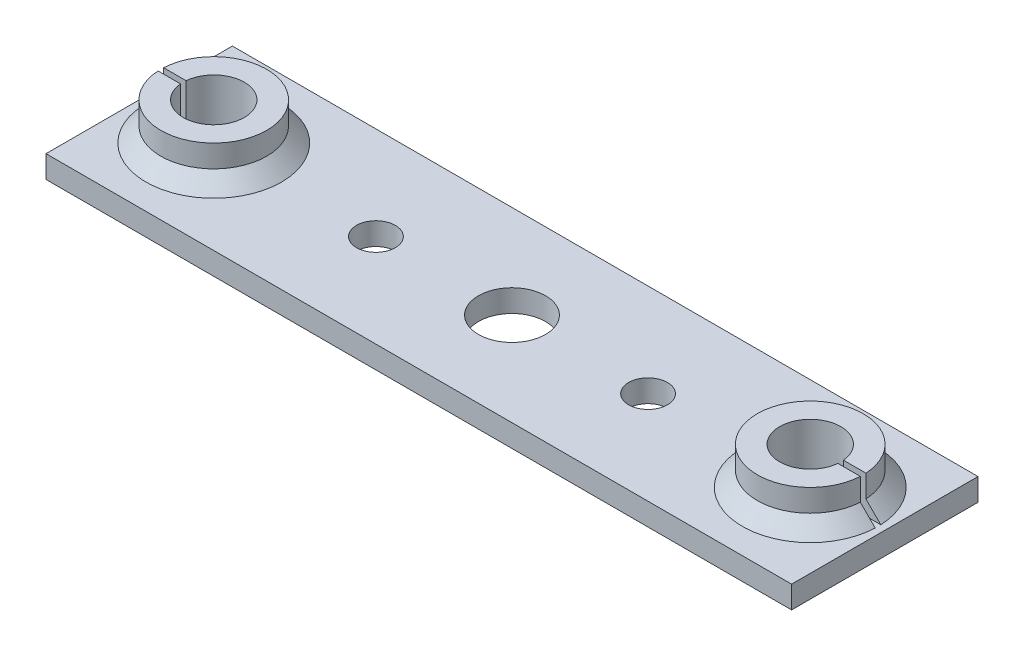
ISO-10303-21;
HEADER;
FILE_DESCRIPTION(('STEP AP214'),'2;1');
FILE_NAME('part.step','',(''),(''),'','','');
FILE_SCHEMA(('AUTOMOTIVE_DESIGN { 1 0 10303 214 1 1 1 1 }'));
ENDSEC;
DATA;
#1=APPLICATION_CONTEXT('core data for automotive mechanical design processes');
#2=APPLICATION_PROTOCOL_DEFINITION('international standard','automotive_design',2000,#1);
#3=PRODUCT_CONTEXT('',#1,'mechanical');
#4=PRODUCT('Part','Part','',(#3));
#5=PRODUCT_RELATED_PRODUCT_CATEGORY('part','',(#4));
#6=PRODUCT_DEFINITION_FORMATION('','',#4);
#7=PRODUCT_DEFINITION_CONTEXT('part definition',#1,'design');
#8=PRODUCT_DEFINITION('design','',#6,#7);
#9=PRODUCT_DEFINITION_SHAPE('','',#8);
#10=(LENGTH_UNIT() NAMED_UNIT(*) SI_UNIT(.MILLI.,.METRE.));
#11=(NAMED_UNIT(*) PLANE_ANGLE_UNIT() SI_UNIT($,.RADIAN.));
#12=(NAMED_UNIT(*) SI_UNIT($,.STERADIAN.) SOLID_ANGLE_UNIT());
#13=UNCERTAINTY_MEASURE_WITH_UNIT(LENGTH_MEASURE(1.E-05),#10,'distance_accuracy_value','');
#14=(GEOMETRIC_REPRESENTATION_CONTEXT(3) GLOBAL_UNCERTAINTY_ASSIGNED_CONTEXT((#13)) GLOBAL_UNIT_ASSIGNED_CONTEXT((#10,
#11,#12)) REPRESENTATION_CONTEXT('',''));
#15=CARTESIAN_POINT('',(0.,0.,0.));
#16=DIRECTION('',(0.,0.,1.));
#17=DIRECTION('',(1.,0.,0.));
#18=AXIS2_PLACEMENT_3D('',#15,#16,#17);
#19=CARTESIAN_POINT('',(0.,3.,0.));
#20=DIRECTION('',(0.,1.,0.));
#21=DIRECTION('',(0.,0.,1.));
#22=AXIS2_PLACEMENT_3D('',#19,#20,#21);
#23=PLANE('',#22);
#24=CARTESIAN_POINT('',(40.,3.,0.));
#25=DIRECTION('',(0.,1.,0.));
#26=DIRECTION('',(0.,0.,1.));
#27=AXIS2_PLACEMENT_3D('',#24,#25,#26);
#28=CIRCLE('',#27,9.10000000000004);
#29=CARTESIAN_POINT('',(49.0922700685803,3.,0.37499999999999));
#30=VERTEX_POINT('',#29);
#31=CARTESIAN_POINT('',(49.0922700685803,3.,-0.375000000000011));
#32=VERTEX_POINT('',#31);
#33=EDGE_CURVE('E267',#30,#32,#28,.F.);
#34=ORIENTED_EDGE('',*,*,#33,.T.);
#35=DIRECTION('',(1.,0.,0.));
#36=VECTOR('',#35,1.);
#37=CARTESIAN_POINT('',(0.,3.,-0.375000000000004));
#38=LINE('',#37,#36);
#39=CARTESIAN_POINT('',(44.0828145929003,3.,-0.37500000000001));
#40=VERTEX_POINT('',#39);
#41=EDGE_CURVE('E162',#40,#32,#38,.T.);
#42=ORIENTED_EDGE('',*,*,#41,.F.);
#43=CARTESIAN_POINT('',(40.,3.,0.));
#44=DIRECTION('',(0.,1.,0.));
#45=DIRECTION('',(0.,0.,-1.));
#46=AXIS2_PLACEMENT_3D('',#43,#44,#45);
#47=CIRCLE('',#46,4.1);
#48=CARTESIAN_POINT('',(44.0828145929003,3.,0.37499999999999));
#49=VERTEX_POINT('',#48);
#50=EDGE_CURVE('E223',#49,#40,#47,.T.);
#51=ORIENTED_EDGE('',*,*,#50,.F.);
#52=DIRECTION('',(1.,0.,0.));
#53=VECTOR('',#52,1.);
#54=CARTESIAN_POINT('',(0.,3.,0.374999999999995));
#55=LINE('',#54,#53);
#56=EDGE_CURVE('E173',#49,#30,#55,.T.);
#57=ORIENTED_EDGE('',*,*,#56,.T.);
#58=EDGE_LOOP('',(#34,#42,#51,#57));
#59=FACE_BOUND('',#58,.T.);
#60=DIRECTION('',(-1.,0.,0.));
#61=VECTOR('',#60,1.);
#62=CARTESIAN_POINT('',(0.,3.,-0.375000000000004));
#63=LINE('',#62,#61);
#64=CARTESIAN_POINT('',(-44.0828145929003,3.,-0.374999999999999));
#65=VERTEX_POINT('',#64);
#66=CARTESIAN_POINT('',(-49.0922700685802,3.,-0.374999999999999));
#67=VERTEX_POINT('',#66);
#68=EDGE_CURVE('E184',#65,#67,#63,.T.);
#69=ORIENTED_EDGE('',*,*,#68,.T.);
#70=CARTESIAN_POINT('',(-40.,3.,0.));
#71=DIRECTION('',(0.,1.,0.));
#72=DIRECTION('',(0.,0.,1.));
#73=AXIS2_PLACEMENT_3D('',#70,#71,#72);
#74=CIRCLE('',#73,9.10000000000001);
#75=CARTESIAN_POINT('',(-49.0922700685802,3.,0.375000000000002));
#76=VERTEX_POINT('',#75);
#77=EDGE_CURVE('E264',#67,#76,#74,.F.);
#78=ORIENTED_EDGE('',*,*,#77,.T.);
#79=DIRECTION('',(-1.,0.,0.));
#80=VECTOR('',#79,1.);
#81=CARTESIAN_POINT('',(0.,3.,0.374999999999995));
#82=LINE('',#81,#80);
#83=CARTESIAN_POINT('',(-44.0828145929003,3.,0.375000000000001));
#84=VERTEX_POINT('',#83);
#85=EDGE_CURVE('E152',#84,#76,#82,.T.);
#86=ORIENTED_EDGE('',*,*,#85,.F.);
#87=CARTESIAN_POINT('',(-40.,3.,0.));
#88=DIRECTION('',(0.,1.,0.));
#89=DIRECTION('',(0.,0.,1.));
#90=AXIS2_PLACEMENT_3D('',#87,#88,#89);
#91=CIRCLE('',#90,4.1);
#92=EDGE_CURVE('E229',#65,#84,#91,.T.);
#93=ORIENTED_EDGE('',*,*,#92,.F.);
#94=EDGE_LOOP('',(#69,#78,#86,#93));
#95=FACE_BOUND('',#94,.T.);
#96=CARTESIAN_POINT('',(18.25,3.,0.));
#97=DIRECTION('',(0.,1.,0.));
#98=DIRECTION('',(0.,0.,-1.));
#99=AXIS2_PLACEMENT_3D('',#96,#97,#98);
#100=CIRCLE('',#99,2.6);
#101=CARTESIAN_POINT('',(18.25,3.,-2.6));
#102=VERTEX_POINT('',#101);
#103=EDGE_CURVE('E211',#102,#102,#100,.T.);
#104=ORIENTED_EDGE('',*,*,#103,.F.);
#105=EDGE_LOOP('',(#104));
#106=FACE_BOUND('',#105,.T.);
#107=DIRECTION('',(0.,0.,1.));
#108=VECTOR('',#107,1.);
#109=CARTESIAN_POINT('',(-50.,3.,12.5));
#110=LINE('',#109,#108);
#111=CARTESIAN_POINT('',(-50.,3.,-12.5));
#112=VERTEX_POINT('',#111);
#113=CARTESIAN_POINT('',(-50.,3.,12.5));
#114=VERTEX_POINT('',#113);
#115=EDGE_CURVE('E235',#112,#114,#110,.T.);
#116=ORIENTED_EDGE('',*,*,#115,.T.);
#117=DIRECTION('',(1.,0.,0.));
#118=VECTOR('',#117,1.);
#119=CARTESIAN_POINT('',(50.,3.,12.5));
#120=LINE('',#119,#118);
#121=CARTESIAN_POINT('',(50.,3.,12.5));
#122=VERTEX_POINT('',#121);
#123=EDGE_CURVE('E238',#114,#122,#120,.T.);
#124=ORIENTED_EDGE('',*,*,#123,.T.);
#125=DIRECTION('',(0.,0.,-1.));
#126=VECTOR('',#125,1.);
#127=CARTESIAN_POINT('',(50.,3.,12.5));
#128=LINE('',#127,#126);
#129=CARTESIAN_POINT('',(50.,3.,-12.5));
#130=VERTEX_POINT('',#129);
#131=EDGE_CURVE('E241',#122,#130,#128,.T.);
#132=ORIENTED_EDGE('',*,*,#131,.T.);
#133=DIRECTION('',(-1.,0.,0.));
#134=VECTOR('',#133,1.);
#135=CARTESIAN_POINT('',(50.,3.,-12.5));
#136=LINE('',#135,#134);
#137=EDGE_CURVE('E243',#130,#112,#136,.T.);
#138=ORIENTED_EDGE('',*,*,#137,.T.);
#139=EDGE_LOOP('',(#116,#124,#132,#138));
#140=FACE_BOUND('',#139,.T.);
#141=CARTESIAN_POINT('',(-18.25,3.,0.));
#142=DIRECTION('',(0.,1.,0.));
#143=DIRECTION('',(0.,0.,1.));
#144=AXIS2_PLACEMENT_3D('',#141,#142,#143);
#145=CIRCLE('',#144,2.6);
#146=CARTESIAN_POINT('',(-18.25,3.,2.6));
#147=VERTEX_POINT('',#146);
#148=EDGE_CURVE('E217',#147,#147,#145,.T.);
#149=ORIENTED_EDGE('',*,*,#148,.F.);
#150=EDGE_LOOP('',(#149));
#151=FACE_BOUND('',#150,.T.);
#152=CARTESIAN_POINT('',(0.,3.,0.));
#153=DIRECTION('',(0.,1.,0.));
#154=DIRECTION('',(0.,0.,1.));
#155=AXIS2_PLACEMENT_3D('',#152,#153,#154);
#156=CIRCLE('',#155,4.5);
#157=CARTESIAN_POINT('',(0.,3.,4.5));
#158=VERTEX_POINT('',#157);
#159=EDGE_CURVE('E205',#158,#158,#156,.T.);
#160=ORIENTED_EDGE('',*,*,#159,.F.);
#161=EDGE_LOOP('',(#160));
#162=FACE_BOUND('',#161,.T.);
#163=ADVANCED_FACE('F35',(#59,#95,#106,#140,#151,#162),#23,.T.);
#164=CARTESIAN_POINT('',(0.,0.,0.));
#165=DIRECTION('',(0.,1.,0.));
#166=DIRECTION('',(0.,0.,1.));
#167=AXIS2_PLACEMENT_3D('',#164,#165,#166);
#168=PLANE('',#167);
#169=DIRECTION('',(0.,0.,1.));
#170=VECTOR('',#169,1.);
#171=CARTESIAN_POINT('',(-50.,0.,12.5));
#172=LINE('',#171,#170);
#173=CARTESIAN_POINT('',(-50.,0.,-12.5));
#174=VERTEX_POINT('',#173);
#175=CARTESIAN_POINT('',(-50.,0.,12.5));
#176=VERTEX_POINT('',#175);
#177=EDGE_CURVE('E232',#174,#176,#172,.T.);
#178=ORIENTED_EDGE('',*,*,#177,.F.);
#179=DIRECTION('',(-1.,0.,0.));
#180=VECTOR('',#179,1.);
#181=CARTESIAN_POINT('',(50.,0.,-12.5));
#182=LINE('',#181,#180);
#183=CARTESIAN_POINT('',(50.,0.,-12.5));
#184=VERTEX_POINT('',#183);
#185=EDGE_CURVE('E239',#184,#174,#182,.T.);
#186=ORIENTED_EDGE('',*,*,#185,.F.);
#187=DIRECTION('',(0.,0.,-1.));
#188=VECTOR('',#187,1.);
#189=CARTESIAN_POINT('',(50.,0.,12.5));
#190=LINE('',#189,#188);
#191=CARTESIAN_POINT('',(50.,0.,12.5));
#192=VERTEX_POINT('',#191);
#193=EDGE_CURVE('E250',#192,#184,#190,.T.);
#194=ORIENTED_EDGE('',*,*,#193,.F.);
#195=DIRECTION('',(1.,0.,0.));
#196=VECTOR('',#195,1.);
#197=CARTESIAN_POINT('',(50.,0.,12.5));
#198=LINE('',#197,#196);
#199=EDGE_CURVE('E248',#176,#192,#198,.T.);
#200=ORIENTED_EDGE('',*,*,#199,.F.);
#201=EDGE_LOOP('',(#178,#186,#194,#200));
#202=FACE_BOUND('',#201,.T.);
#203=CARTESIAN_POINT('',(-40.,0.,0.));
#204=DIRECTION('',(0.,1.,0.));
#205=DIRECTION('',(0.,0.,1.));
#206=AXIS2_PLACEMENT_3D('',#203,#204,#205);
#207=CIRCLE('',#206,4.1);
#208=CARTESIAN_POINT('',(-40.,0.,4.1));
#209=VERTEX_POINT('',#208);
#210=EDGE_CURVE('E226',#209,#209,#207,.T.);
#211=ORIENTED_EDGE('',*,*,#210,.T.);
#212=EDGE_LOOP('',(#211));
#213=FACE_BOUND('',#212,.T.);
#214=CARTESIAN_POINT('',(40.,0.,0.));
#215=DIRECTION('',(0.,1.,0.));
#216=DIRECTION('',(0.,0.,-1.));
#217=AXIS2_PLACEMENT_3D('',#214,#215,#216);
#218=CIRCLE('',#217,4.1);
#219=CARTESIAN_POINT('',(40.,0.,-4.10000000000001));
#220=VERTEX_POINT('',#219);
#221=EDGE_CURVE('E220',#220,#220,#218,.T.);
#222=ORIENTED_EDGE('',*,*,#221,.T.);
#223=EDGE_LOOP('',(#222));
#224=FACE_BOUND('',#223,.T.);
#225=CARTESIAN_POINT('',(-18.25,0.,0.));
#226=DIRECTION('',(0.,1.,0.));
#227=DIRECTION('',(0.,0.,1.));
#228=AXIS2_PLACEMENT_3D('',#225,#226,#227);
#229=CIRCLE('',#228,2.6);
#230=CARTESIAN_POINT('',(-18.25,0.,2.6));
#231=VERTEX_POINT('',#230);
#232=EDGE_CURVE('E214',#231,#231,#229,.T.);
#233=ORIENTED_EDGE('',*,*,#232,.T.);
#234=EDGE_LOOP('',(#233));
#235=FACE_BOUND('',#234,.T.);
#236=CARTESIAN_POINT('',(18.25,0.,0.));
#237=DIRECTION('',(0.,1.,0.));
#238=DIRECTION('',(0.,0.,-1.));
#239=AXIS2_PLACEMENT_3D('',#236,#237,#238);
#240=CIRCLE('',#239,2.6);
#241=CARTESIAN_POINT('',(18.25,0.,-2.6));
#242=VERTEX_POINT('',#241);
#243=EDGE_CURVE('E208',#242,#242,#240,.T.);
#244=ORIENTED_EDGE('',*,*,#243,.T.);
#245=EDGE_LOOP('',(#244));
#246=FACE_BOUND('',#245,.T.);
#247=CARTESIAN_POINT('',(0.,0.,0.));
#248=DIRECTION('',(0.,1.,0.));
#249=DIRECTION('',(0.,0.,1.));
#250=AXIS2_PLACEMENT_3D('',#247,#248,#249);
#251=CIRCLE('',#250,4.5);
#252=CARTESIAN_POINT('',(0.,0.,4.5));
#253=VERTEX_POINT('',#252);
#254=EDGE_CURVE('E204',#253,#253,#251,.T.);
#255=ORIENTED_EDGE('',*,*,#254,.T.);
#256=EDGE_LOOP('',(#255));
#257=FACE_BOUND('',#256,.T.);
#258=ADVANCED_FACE('F297',(#202,#213,#224,#235,#246,#257),#168,.F.);
#259=CARTESIAN_POINT('',(-50.,3.,12.5));
#260=DIRECTION('',(1.,0.,0.));
#261=DIRECTION('',(0.,0.,-1.));
#262=AXIS2_PLACEMENT_3D('',#259,#260,#261);
#263=PLANE('',#262);
#264=ORIENTED_EDGE('',*,*,#177,.T.);
#265=DIRECTION('',(0.,-1.,0.));
#266=VECTOR('',#265,1.);
#267=CARTESIAN_POINT('',(-50.,3.,12.5));
#268=LINE('',#267,#266);
#269=EDGE_CURVE('E261',#114,#176,#268,.T.);
#270=ORIENTED_EDGE('',*,*,#269,.F.);
#271=ORIENTED_EDGE('',*,*,#115,.F.);
#272=DIRECTION('',(0.,-1.,0.));
#273=VECTOR('',#272,1.);
#274=CARTESIAN_POINT('',(-50.,3.,-12.5));
#275=LINE('',#274,#273);
#276=EDGE_CURVE('E245',#112,#174,#275,.T.);
#277=ORIENTED_EDGE('',*,*,#276,.T.);
#278=EDGE_LOOP('',(#264,#270,#271,#277));
#279=FACE_BOUND('',#278,.T.);
#280=ADVANCED_FACE('F292',(#279),#263,.F.);
#281=CARTESIAN_POINT('',(50.,3.,12.5));
#282=DIRECTION('',(0.,0.,-1.));
#283=DIRECTION('',(-1.,0.,0.));
#284=AXIS2_PLACEMENT_3D('',#281,#282,#283);
#285=PLANE('',#284);
#286=ORIENTED_EDGE('',*,*,#199,.T.);
#287=DIRECTION('',(0.,-1.,0.));
#288=VECTOR('',#287,1.);
#289=CARTESIAN_POINT('',(50.,3.,12.5));
#290=LINE('',#289,#288);
#291=EDGE_CURVE('E258',#122,#192,#290,.T.);
#292=ORIENTED_EDGE('',*,*,#291,.F.);
#293=ORIENTED_EDGE('',*,*,#123,.F.);
#294=ORIENTED_EDGE('',*,*,#269,.T.);
#295=EDGE_LOOP('',(#286,#292,#293,#294));
#296=FACE_BOUND('',#295,.T.);
#297=ADVANCED_FACE('F296',(#296),#285,.F.);
#298=CARTESIAN_POINT('',(50.,3.,12.5));
#299=DIRECTION('',(-1.,0.,0.));
#300=DIRECTION('',(0.,0.,1.));
#301=AXIS2_PLACEMENT_3D('',#298,#299,#300);
#302=PLANE('',#301);
#303=ORIENTED_EDGE('',*,*,#193,.T.);
#304=DIRECTION('',(0.,-1.,0.));
#305=VECTOR('',#304,1.);
#306=CARTESIAN_POINT('',(50.,3.,-12.5));
#307=LINE('',#306,#305);
#308=EDGE_CURVE('E255',#130,#184,#307,.T.);
#309=ORIENTED_EDGE('',*,*,#308,.F.);
#310=ORIENTED_EDGE('',*,*,#131,.F.);
#311=ORIENTED_EDGE('',*,*,#291,.T.);
#312=EDGE_LOOP('',(#303,#309,#310,#311));
#313=FACE_BOUND('',#312,.T.);
#314=ADVANCED_FACE('F301',(#313),#302,.F.);
#315=CARTESIAN_POINT('',(50.,3.,-12.5));
#316=DIRECTION('',(0.,0.,1.));
#317=DIRECTION('',(1.,0.,0.));
#318=AXIS2_PLACEMENT_3D('',#315,#316,#317);
#319=PLANE('',#318);
#320=ORIENTED_EDGE('',*,*,#185,.T.);
#321=ORIENTED_EDGE('',*,*,#276,.F.);
#322=ORIENTED_EDGE('',*,*,#137,.F.);
#323=ORIENTED_EDGE('',*,*,#308,.T.);
#324=EDGE_LOOP('',(#320,#321,#322,#323));
#325=FACE_BOUND('',#324,.T.);
#326=ADVANCED_FACE('F305',(#325),#319,.F.);
#327=CARTESIAN_POINT('',(-40.,3.,0.));
#328=DIRECTION('',(0.,-1.,0.));
#329=DIRECTION('',(0.,0.,-1.));
#330=AXIS2_PLACEMENT_3D('',#327,#328,#329);
#331=CYLINDRICAL_SURFACE('',#330,4.1);
#332=ORIENTED_EDGE('',*,*,#92,.T.);
#333=DIRECTION('',(0.,-1.,0.));
#334=VECTOR('',#333,1.);
#335=CARTESIAN_POINT('',(-44.0828145929003,8.,0.375000000000001));
#336=LINE('',#335,#334);
#337=CARTESIAN_POINT('',(-44.0828145929003,8.,0.375000000000001));
#338=VERTEX_POINT('',#337);
#339=EDGE_CURVE('E191',#338,#84,#336,.T.);
#340=ORIENTED_EDGE('',*,*,#339,.F.);
#341=CARTESIAN_POINT('',(-40.,8.,0.));
#342=DIRECTION('',(0.,1.,0.));
#343=DIRECTION('',(0.,0.,1.));
#344=AXIS2_PLACEMENT_3D('',#341,#342,#343);
#345=CIRCLE('',#344,4.1);
#346=CARTESIAN_POINT('',(-44.0828145929003,8.,-0.374999999999999));
#347=VERTEX_POINT('',#346);
#348=EDGE_CURVE('E189',#347,#338,#345,.F.);
#349=ORIENTED_EDGE('',*,*,#348,.F.);
#350=DIRECTION('',(0.,-1.,0.));
#351=VECTOR('',#350,1.);
#352=CARTESIAN_POINT('',(-44.0828145929003,8.,-0.374999999999999));
#353=LINE('',#352,#351);
#354=EDGE_CURVE('E196',#347,#65,#353,.T.);
#355=ORIENTED_EDGE('',*,*,#354,.T.);
#356=EDGE_LOOP('',(#332,#340,#349,#355));
#357=FACE_BOUND('',#356,.T.);
#358=ORIENTED_EDGE('',*,*,#210,.F.);
#359=EDGE_LOOP('',(#358));
#360=FACE_BOUND('',#359,.T.);
#361=ADVANCED_FACE('F309',(#357,#360),#331,.F.);
#362=CARTESIAN_POINT('',(40.,3.,0.));
#363=DIRECTION('',(0.,-1.,0.));
#364=DIRECTION('',(0.,0.,-1.));
#365=AXIS2_PLACEMENT_3D('',#362,#363,#364);
#366=CYLINDRICAL_SURFACE('',#365,4.1);
#367=ORIENTED_EDGE('',*,*,#50,.T.);
#368=DIRECTION('',(0.,-1.,0.));
#369=VECTOR('',#368,1.);
#370=CARTESIAN_POINT('',(44.0828145929003,8.,-0.37500000000001));
#371=LINE('',#370,#369);
#372=CARTESIAN_POINT('',(44.0828145929003,8.,-0.37500000000001));
#373=VERTEX_POINT('',#372);
#374=EDGE_CURVE('E177',#373,#40,#371,.T.);
#375=ORIENTED_EDGE('',*,*,#374,.F.);
#376=CARTESIAN_POINT('',(40.,8.,0.));
#377=DIRECTION('',(0.,1.,0.));
#378=DIRECTION('',(0.,0.,1.));
#379=AXIS2_PLACEMENT_3D('',#376,#377,#378);
#380=CIRCLE('',#379,4.1);
#381=CARTESIAN_POINT('',(44.0828145929003,8.,0.37499999999999));
#382=VERTEX_POINT('',#381);
#383=EDGE_CURVE('E167',#382,#373,#380,.F.);
#384=ORIENTED_EDGE('',*,*,#383,.F.);
#385=DIRECTION('',(0.,-1.,0.));
#386=VECTOR('',#385,1.);
#387=CARTESIAN_POINT('',(44.0828145929003,8.,0.37499999999999));
#388=LINE('',#387,#386);
#389=EDGE_CURVE('E153',#382,#49,#388,.T.);
#390=ORIENTED_EDGE('',*,*,#389,.T.);
#391=EDGE_LOOP('',(#367,#375,#384,#390));
#392=FACE_BOUND('',#391,.T.);
#393=ORIENTED_EDGE('',*,*,#221,.F.);
#394=EDGE_LOOP('',(#393));
#395=FACE_BOUND('',#394,.T.);
#396=ADVANCED_FACE('F319',(#392,#395),#366,.F.);
#397=CARTESIAN_POINT('',(-18.25,3.,0.));
#398=DIRECTION('',(0.,-1.,0.));
#399=DIRECTION('',(0.,0.,-1.));
#400=AXIS2_PLACEMENT_3D('',#397,#398,#399);
#401=CYLINDRICAL_SURFACE('',#400,2.6);
#402=ORIENTED_EDGE('',*,*,#148,.T.);
#403=EDGE_LOOP('',(#402));
#404=FACE_BOUND('',#403,.T.);
#405=ORIENTED_EDGE('',*,*,#232,.F.);
#406=EDGE_LOOP('',(#405));
#407=FACE_BOUND('',#406,.T.);
#408=ADVANCED_FACE('F323',(#404,#407),#401,.F.);
#409=CARTESIAN_POINT('',(18.25,3.,0.));
#410=DIRECTION('',(0.,-1.,0.));
#411=DIRECTION('',(0.,0.,-1.));
#412=AXIS2_PLACEMENT_3D('',#409,#410,#411);
#413=CYLINDRICAL_SURFACE('',#412,2.6);
#414=ORIENTED_EDGE('',*,*,#103,.T.);
#415=EDGE_LOOP('',(#414));
#416=FACE_BOUND('',#415,.T.);
#417=ORIENTED_EDGE('',*,*,#243,.F.);
#418=EDGE_LOOP('',(#417));
#419=FACE_BOUND('',#418,.T.);
#420=ADVANCED_FACE('F327',(#416,#419),#413,.F.);
#421=CARTESIAN_POINT('',(0.,3.,0.));
#422=DIRECTION('',(0.,-1.,0.));
#423=DIRECTION('',(0.,0.,-1.));
#424=AXIS2_PLACEMENT_3D('',#421,#422,#423);
#425=CYLINDRICAL_SURFACE('',#424,4.5);
#426=ORIENTED_EDGE('',*,*,#159,.T.);
#427=EDGE_LOOP('',(#426));
#428=FACE_BOUND('',#427,.T.);
#429=ORIENTED_EDGE('',*,*,#254,.F.);
#430=EDGE_LOOP('',(#429));
#431=FACE_BOUND('',#430,.T.);
#432=ADVANCED_FACE('F331',(#428,#431),#425,.F.);
#433=CARTESIAN_POINT('',(0.,8.,0.374999999999995));
#434=DIRECTION('',(0.,0.,1.));
#435=DIRECTION('',(1.,0.,0.));
#436=AXIS2_PLACEMENT_3D('',#433,#434,#435);
#437=PLANE('',#436);
#438=ORIENTED_EDGE('',*,*,#85,.T.);
#439=CARTESIAN_POINT('',(-49.0922700685802,3.,0.375000000000001));
#440=CARTESIAN_POINT('',(-48.7586182600258,3.33337826562822,0.375000000000001));
#441=CARTESIAN_POINT('',(-48.4249440096939,3.66673406501575,0.375000000000001));
#442=CARTESIAN_POINT('',(-47.7575506251017,4.33340073168248,0.375000000000001));
#443=CARTESIAN_POINT('',(-47.4238314908414,4.66671159896163,0.375000000000001));
#444=CARTESIAN_POINT('',(-47.0900899148036,5.00000000000003,0.375000000000001));
#445=B_SPLINE_CURVE_WITH_KNOTS('',3,(#439,#440,#441,#442,#443,#444),.UNSPECIFIED.,.F.,.F.,(4,2,
4),(0.,1.41498457549145,2.82996915256656),.UNSPECIFIED.);
#446=CARTESIAN_POINT('',(-47.0900899148036,5.00000000000003,0.375000000000001));
#447=VERTEX_POINT('',#446);
#448=EDGE_CURVE('E11',#76,#447,#445,.T.);
#449=ORIENTED_EDGE('',*,*,#448,.T.);
#450=DIRECTION('',(0.,-1.,0.));
#451=VECTOR('',#450,1.);
#452=CARTESIAN_POINT('',(-47.0900899148036,8.,0.375000000000001));
#453=LINE('',#452,#451);
#454=CARTESIAN_POINT('',(-47.0900899148036,8.,0.375000000000001));
#455=VERTEX_POINT('',#454);
#456=EDGE_CURVE('E202',#455,#447,#453,.T.);
#457=ORIENTED_EDGE('',*,*,#456,.F.);
#458=DIRECTION('',(-1.,0.,0.));
#459=VECTOR('',#458,1.);
#460=CARTESIAN_POINT('',(0.,8.,0.374999999999995));
#461=LINE('',#460,#459);
#462=EDGE_CURVE('E180',#338,#455,#461,.T.);
#463=ORIENTED_EDGE('',*,*,#462,.F.);
#464=ORIENTED_EDGE('',*,*,#339,.T.);
#465=EDGE_LOOP('',(#438,#449,#457,#463,#464));
#466=FACE_BOUND('',#465,.T.);
#467=ADVANCED_FACE('F334',(#466),#437,.F.);
#468=CARTESIAN_POINT('',(-40.,8.,0.));
#469=DIRECTION('',(0.,-1.,0.));
#470=DIRECTION('',(0.,0.,-1.));
#471=AXIS2_PLACEMENT_3D('',#468,#469,#470);
#472=CYLINDRICAL_SURFACE('',#471,7.1);
#473=ORIENTED_EDGE('',*,*,#456,.T.);
#474=CARTESIAN_POINT('',(-40.,5.00000000000003,0.));
#475=DIRECTION('',(0.,1.,0.));
#476=DIRECTION('',(0.,0.,1.));
#477=AXIS2_PLACEMENT_3D('',#474,#475,#476);
#478=CIRCLE('',#477,7.1);
#479=CARTESIAN_POINT('',(-47.0900899148036,5.00000000000003,-0.374999999999999));
#480=VERTEX_POINT('',#479);
#481=EDGE_CURVE('E271',#447,#480,#478,.T.);
#482=ORIENTED_EDGE('',*,*,#481,.T.);
#483=DIRECTION('',(0.,-1.,0.));
#484=VECTOR('',#483,1.);
#485=CARTESIAN_POINT('',(-47.0900899148036,8.,-0.374999999999999));
#486=LINE('',#485,#484);
#487=CARTESIAN_POINT('',(-47.0900899148036,8.,-0.374999999999999));
#488=VERTEX_POINT('',#487);
#489=EDGE_CURVE('E199',#488,#480,#486,.T.);
#490=ORIENTED_EDGE('',*,*,#489,.F.);
#491=CARTESIAN_POINT('',(-40.,8.,0.));
#492=DIRECTION('',(0.,1.,0.));
#493=DIRECTION('',(0.,0.,1.));
#494=AXIS2_PLACEMENT_3D('',#491,#492,#493);
#495=CIRCLE('',#494,7.1);
#496=EDGE_CURVE('E183',#455,#488,#495,.T.);
#497=ORIENTED_EDGE('',*,*,#496,.F.);
#498=EDGE_LOOP('',(#473,#482,#490,#497));
#499=FACE_BOUND('',#498,.T.);
#500=ADVANCED_FACE('F339',(#499),#472,.T.);
#501=CARTESIAN_POINT('',(0.,8.,-0.375000000000004));
#502=DIRECTION('',(0.,0.,1.));
#503=DIRECTION('',(1.,0.,0.));
#504=AXIS2_PLACEMENT_3D('',#501,#502,#503);
#505=PLANE('',#504);
#506=ORIENTED_EDGE('',*,*,#68,.F.);
#507=ORIENTED_EDGE('',*,*,#354,.F.);
#508=DIRECTION('',(-1.,0.,0.));
#509=VECTOR('',#508,1.);
#510=CARTESIAN_POINT('',(0.,8.,-0.375000000000004));
#511=LINE('',#510,#509);
#512=EDGE_CURVE('E186',#347,#488,#511,.T.);
#513=ORIENTED_EDGE('',*,*,#512,.T.);
#514=ORIENTED_EDGE('',*,*,#489,.T.);
#515=CARTESIAN_POINT('',(-47.0900899148036,5.00000000000003,-0.374999999999999));
#516=CARTESIAN_POINT('',(-47.4238314908414,4.66671159896163,-0.374999999999999));
#517=CARTESIAN_POINT('',(-47.7575506251017,4.33340073168248,-0.374999999999999));
#518=CARTESIAN_POINT('',(-48.4249440096939,3.66673406501575,-0.374999999999999));
#519=CARTESIAN_POINT('',(-48.7586182600258,3.33337826562822,-0.374999999999999));
#520=CARTESIAN_POINT('',(-49.0922700685802,3.,-0.374999999999999));
#521=B_SPLINE_CURVE_WITH_KNOTS('',3,(#515,#516,#517,#518,#519,#520),.UNSPECIFIED.,.F.,.F.,(4,2,
4),(0.,1.41498457707511,2.82996915256655),.UNSPECIFIED.);
#522=EDGE_CURVE('E48',#480,#67,#521,.T.);
#523=ORIENTED_EDGE('',*,*,#522,.T.);
#524=EDGE_LOOP('',(#506,#507,#513,#514,#523));
#525=FACE_BOUND('',#524,.T.);
#526=ADVANCED_FACE('F342',(#525),#505,.T.);
#527=CARTESIAN_POINT('',(0.,8.,0.));
#528=DIRECTION('',(0.,1.,0.));
#529=DIRECTION('',(0.,0.,1.));
#530=AXIS2_PLACEMENT_3D('',#527,#528,#529);
#531=PLANE('',#530);
#532=ORIENTED_EDGE('',*,*,#462,.T.);
#533=ORIENTED_EDGE('',*,*,#496,.T.);
#534=ORIENTED_EDGE('',*,*,#512,.F.);
#535=ORIENTED_EDGE('',*,*,#348,.T.);
#536=EDGE_LOOP('',(#532,#533,#534,#535));
#537=FACE_BOUND('',#536,.T.);
#538=ADVANCED_FACE('F347',(#537),#531,.T.);
#539=CARTESIAN_POINT('',(40.,8.,0.));
#540=DIRECTION('',(0.,-1.,0.));
#541=DIRECTION('',(0.,0.,-1.));
#542=AXIS2_PLACEMENT_3D('',#539,#540,#541);
#543=CYLINDRICAL_SURFACE('',#542,7.1);
#544=DIRECTION('',(0.,-1.,0.));
#545=VECTOR('',#544,1.);
#546=CARTESIAN_POINT('',(47.0900899148036,8.,-0.37500000000001));
#547=LINE('',#546,#545);
#548=CARTESIAN_POINT('',(47.0900899148036,8.,-0.37500000000001));
#549=VERTEX_POINT('',#548);
#550=CARTESIAN_POINT('',(47.0900899148036,5.00000000000003,-0.37500000000001));
#551=VERTEX_POINT('',#550);
#552=EDGE_CURVE('E172',#549,#551,#547,.T.);
#553=ORIENTED_EDGE('',*,*,#552,.T.);
#554=CARTESIAN_POINT('',(40.,5.00000000000003,0.));
#555=DIRECTION('',(0.,1.,0.));
#556=DIRECTION('',(0.,0.,1.));
#557=AXIS2_PLACEMENT_3D('',#554,#555,#556);
#558=CIRCLE('',#557,7.1);
#559=CARTESIAN_POINT('',(47.0900899148036,5.00000000000003,0.37499999999999));
#560=VERTEX_POINT('',#559);
#561=EDGE_CURVE('E147',#551,#560,#558,.T.);
#562=ORIENTED_EDGE('',*,*,#561,.T.);
#563=DIRECTION('',(0.,-1.,0.));
#564=VECTOR('',#563,1.);
#565=CARTESIAN_POINT('',(47.0900899148036,8.,0.37499999999999));
#566=LINE('',#565,#564);
#567=CARTESIAN_POINT('',(47.0900899148036,8.,0.37499999999999));
#568=VERTEX_POINT('',#567);
#569=EDGE_CURVE('E141',#568,#560,#566,.T.);
#570=ORIENTED_EDGE('',*,*,#569,.F.);
#571=CARTESIAN_POINT('',(40.,8.,0.));
#572=DIRECTION('',(0.,1.,0.));
#573=DIRECTION('',(0.,0.,1.));
#574=AXIS2_PLACEMENT_3D('',#571,#572,#573);
#575=CIRCLE('',#574,7.1);
#576=EDGE_CURVE('E145',#568,#549,#575,.F.);
#577=ORIENTED_EDGE('',*,*,#576,.T.);
#578=EDGE_LOOP('',(#553,#562,#570,#577));
#579=FACE_BOUND('',#578,.T.);
#580=ADVANCED_FACE('F144',(#579),#543,.T.);
#581=CARTESIAN_POINT('',(0.,8.,0.374999999999995));
#582=DIRECTION('',(0.,0.,-1.));
#583=DIRECTION('',(-1.,0.,0.));
#584=AXIS2_PLACEMENT_3D('',#581,#582,#583);
#585=PLANE('',#584);
#586=ORIENTED_EDGE('',*,*,#56,.F.);
#587=ORIENTED_EDGE('',*,*,#389,.F.);
#588=DIRECTION('',(1.,0.,0.));
#589=VECTOR('',#588,1.);
#590=CARTESIAN_POINT('',(0.,8.,0.374999999999995));
#591=LINE('',#590,#589);
#592=EDGE_CURVE('E158',#382,#568,#591,.T.);
#593=ORIENTED_EDGE('',*,*,#592,.T.);
#594=ORIENTED_EDGE('',*,*,#569,.T.);
#595=CARTESIAN_POINT('',(47.0900899148036,5.00000000000003,0.37499999999999));
#596=CARTESIAN_POINT('',(47.4238314908414,4.66671159896163,0.37499999999999));
#597=CARTESIAN_POINT('',(47.7575506251017,4.33340073168248,0.37499999999999));
#598=CARTESIAN_POINT('',(48.4249440096939,3.66673406501575,0.37499999999999));
#599=CARTESIAN_POINT('',(48.7586182600258,3.33337826562822,0.37499999999999));
#600=CARTESIAN_POINT('',(49.0922700685803,3.,0.37499999999999));
#601=B_SPLINE_CURVE_WITH_KNOTS('',3,(#595,#596,#597,#598,#599,#600),.UNSPECIFIED.,.F.,.F.,(4,2,
4),(0.,1.41498457707511,2.82996915256657),.UNSPECIFIED.);
#602=EDGE_CURVE('E279',#560,#30,#601,.T.);
#603=ORIENTED_EDGE('',*,*,#602,.T.);
#604=EDGE_LOOP('',(#586,#587,#593,#594,#603));
#605=FACE_BOUND('',#604,.T.);
#606=ADVANCED_FACE('F164',(#605),#585,.T.);
#607=CARTESIAN_POINT('',(0.,8.,-0.375000000000004));
#608=DIRECTION('',(0.,0.,-1.));
#609=DIRECTION('',(-1.,0.,0.));
#610=AXIS2_PLACEMENT_3D('',#607,#608,#609);
#611=PLANE('',#610);
#612=ORIENTED_EDGE('',*,*,#41,.T.);
#613=CARTESIAN_POINT('',(49.0922700685803,3.,-0.375000000000011));
#614=CARTESIAN_POINT('',(48.7586182600258,3.33337826562822,-0.375000000000011));
#615=CARTESIAN_POINT('',(48.4249440096939,3.66673406501575,-0.375000000000011));
#616=CARTESIAN_POINT('',(47.7575506251017,4.33340073168248,-0.375000000000011));
#617=CARTESIAN_POINT('',(47.4238314908414,4.66671159896162,-0.37500000000001));
#618=CARTESIAN_POINT('',(47.0900899148036,5.00000000000002,-0.37500000000001));
#619=B_SPLINE_CURVE_WITH_KNOTS('',3,(#613,#614,#615,#616,#617,#618),.UNSPECIFIED.,.F.,.F.,(4,2,
4),(0.,1.41498457549146,2.82996915256657),.UNSPECIFIED.);
#620=EDGE_CURVE('E273',#32,#551,#619,.T.);
#621=ORIENTED_EDGE('',*,*,#620,.T.);
#622=ORIENTED_EDGE('',*,*,#552,.F.);
#623=DIRECTION('',(1.,0.,0.));
#624=VECTOR('',#623,1.);
#625=CARTESIAN_POINT('',(0.,8.,-0.375000000000004));
#626=LINE('',#625,#624);
#627=EDGE_CURVE('E160',#373,#549,#626,.T.);
#628=ORIENTED_EDGE('',*,*,#627,.F.);
#629=ORIENTED_EDGE('',*,*,#374,.T.);
#630=EDGE_LOOP('',(#612,#621,#622,#628,#629));
#631=FACE_BOUND('',#630,.T.);
#632=ADVANCED_FACE('F284',(#631),#611,.F.);
#633=CARTESIAN_POINT('',(0.,8.,0.));
#634=DIRECTION('',(0.,1.,0.));
#635=DIRECTION('',(0.,0.,1.));
#636=AXIS2_PLACEMENT_3D('',#633,#634,#635);
#637=PLANE('',#636);
#638=ORIENTED_EDGE('',*,*,#576,.F.);
#639=ORIENTED_EDGE('',*,*,#592,.F.);
#640=ORIENTED_EDGE('',*,*,#383,.T.);
#641=ORIENTED_EDGE('',*,*,#627,.T.);
#642=EDGE_LOOP('',(#638,#639,#640,#641));
#643=FACE_BOUND('',#642,.T.);
#644=ADVANCED_FACE('F157',(#643),#637,.T.);
#645=CARTESIAN_POINT('',(40.,3.,0.));
#646=DIRECTION('',(0.,-1.,0.));
#647=DIRECTION('',(0.,0.,-1.));
#648=AXIS2_PLACEMENT_3D('',#645,#646,#647);
#649=CONICAL_SURFACE('',#648,9.10000000000004,0.785398163397451);
#650=ORIENTED_EDGE('',*,*,#602,.F.);
#651=ORIENTED_EDGE('',*,*,#561,.F.);
#652=ORIENTED_EDGE('',*,*,#620,.F.);
#653=ORIENTED_EDGE('',*,*,#33,.F.);
#654=EDGE_LOOP('',(#650,#651,#652,#653));
#655=FACE_BOUND('',#654,.T.);
#656=ADVANCED_FACE('F287',(#655),#649,.T.);
#657=CARTESIAN_POINT('',(-40.,5.00000000000003,0.));
#658=DIRECTION('',(0.,-1.,0.));
#659=DIRECTION('',(0.,0.,-1.));
#660=AXIS2_PLACEMENT_3D('',#657,#658,#659);
#661=CONICAL_SURFACE('',#660,7.1,0.785398163397443);
#662=ORIENTED_EDGE('',*,*,#448,.F.);
#663=ORIENTED_EDGE('',*,*,#77,.F.);
#664=ORIENTED_EDGE('',*,*,#522,.F.);
#665=ORIENTED_EDGE('',*,*,#481,.F.);
#666=EDGE_LOOP('',(#662,#663,#664,#665));
#667=FACE_BOUND('',#666,.T.);
#668=ADVANCED_FACE('F37',(#667),#661,.T.);
#669=CLOSED_SHELL('',(#163,#258,#280,#297,#314,#326,#361,#396,#408,#420,#432,#467,#500,#526,
#538,#580,#606,#632,#644,#656,#668));
#670=MANIFOLD_SOLID_BREP('B2',#669);
#671=ADVANCED_BREP_SHAPE_REPRESENTATION('',(#18,#670),#14);
#672=SHAPE_DEFINITION_REPRESENTATION(#9,#671);
ENDSEC;
END-ISO-10303-21;
